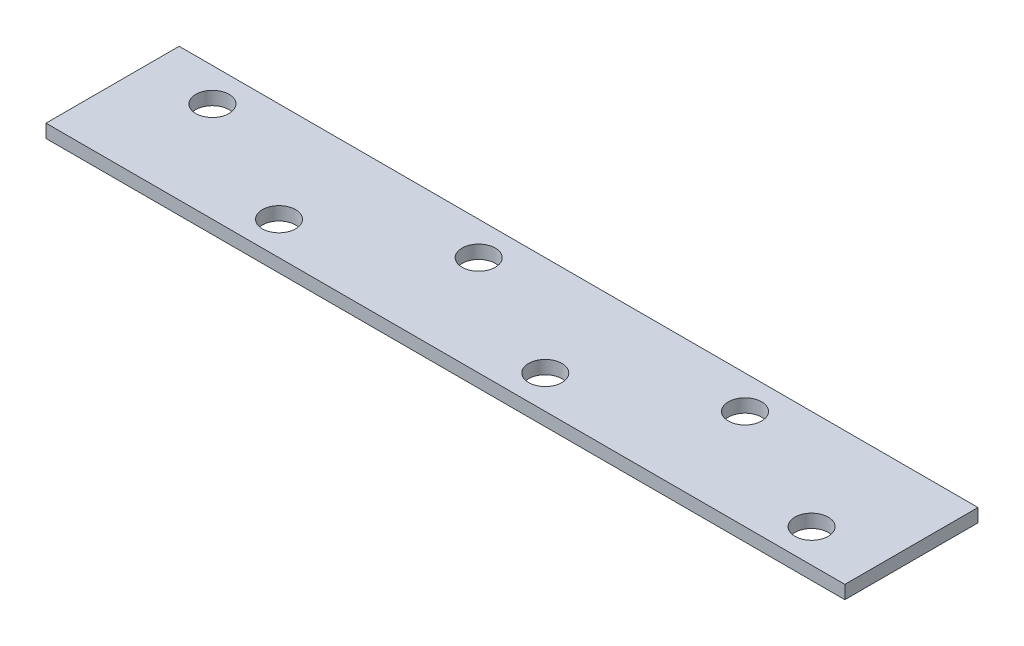
ISO-10303-21;
HEADER;
FILE_DESCRIPTION(('STEP AP214'),'2;1');
FILE_NAME('part.step','',(''),(''),'','','');
FILE_SCHEMA(('AUTOMOTIVE_DESIGN { 1 0 10303 214 1 1 1 1 }'));
ENDSEC;
DATA;
#1=APPLICATION_CONTEXT('core data for automotive mechanical design processes');
#2=APPLICATION_PROTOCOL_DEFINITION('international standard','automotive_design',2000,#1);
#3=PRODUCT_CONTEXT('',#1,'mechanical');
#4=PRODUCT('Part','Part','',(#3));
#5=PRODUCT_RELATED_PRODUCT_CATEGORY('part','',(#4));
#6=PRODUCT_DEFINITION_FORMATION('','',#4);
#7=PRODUCT_DEFINITION_CONTEXT('part definition',#1,'design');
#8=PRODUCT_DEFINITION('design','',#6,#7);
#9=PRODUCT_DEFINITION_SHAPE('','',#8);
#10=(LENGTH_UNIT() NAMED_UNIT(*) SI_UNIT(.MILLI.,.METRE.));
#11=(NAMED_UNIT(*) PLANE_ANGLE_UNIT() SI_UNIT($,.RADIAN.));
#12=(NAMED_UNIT(*) SI_UNIT($,.STERADIAN.) SOLID_ANGLE_UNIT());
#13=UNCERTAINTY_MEASURE_WITH_UNIT(LENGTH_MEASURE(1.E-05),#10,'distance_accuracy_value','');
#14=(GEOMETRIC_REPRESENTATION_CONTEXT(3) GLOBAL_UNCERTAINTY_ASSIGNED_CONTEXT((#13)) GLOBAL_UNIT_ASSIGNED_CONTEXT((#10,
#11,#12)) REPRESENTATION_CONTEXT('',''));
#15=CARTESIAN_POINT('',(0.,0.,0.));
#16=DIRECTION('',(0.,0.,1.));
#17=DIRECTION('',(1.,0.,0.));
#18=AXIS2_PLACEMENT_3D('',#15,#16,#17);
#19=CARTESIAN_POINT('',(0.,2.,0.));
#20=DIRECTION('',(0.,1.,0.));
#21=DIRECTION('',(0.,0.,1.));
#22=AXIS2_PLACEMENT_3D('',#19,#20,#21);
#23=PLANE('',#22);
#24=CARTESIAN_POINT('',(10.0000000000001,2.,5.));
#25=DIRECTION('',(0.,1.,0.));
#26=DIRECTION('',(0.,0.,1.));
#27=AXIS2_PLACEMENT_3D('',#24,#25,#26);
#28=CIRCLE('',#27,2.5);
#29=CARTESIAN_POINT('',(10.0000000000001,2.,7.5));
#30=VERTEX_POINT('',#29);
#31=EDGE_CURVE('E135',#30,#30,#28,.T.);
#32=ORIENTED_EDGE('',*,*,#31,.F.);
#33=EDGE_LOOP('',(#32));
#34=FACE_BOUND('',#33,.T.);
#35=CARTESIAN_POINT('',(30.,2.,-5.));
#36=DIRECTION('',(0.,1.,0.));
#37=DIRECTION('',(0.,0.,1.));
#38=AXIS2_PLACEMENT_3D('',#35,#36,#37);
#39=CIRCLE('',#38,2.5);
#40=CARTESIAN_POINT('',(30.,2.,-2.5));
#41=VERTEX_POINT('',#40);
#42=EDGE_CURVE('E123',#41,#41,#39,.T.);
#43=ORIENTED_EDGE('',*,*,#42,.F.);
#44=EDGE_LOOP('',(#43));
#45=FACE_BOUND('',#44,.T.);
#46=CARTESIAN_POINT('',(-50.,2.,-5.));
#47=DIRECTION('',(0.,1.,0.));
#48=DIRECTION('',(0.,0.,1.));
#49=AXIS2_PLACEMENT_3D('',#46,#47,#48);
#50=CIRCLE('',#49,2.5);
#51=CARTESIAN_POINT('',(-50.,2.,-2.5));
#52=VERTEX_POINT('',#51);
#53=EDGE_CURVE('E102',#52,#52,#50,.T.);
#54=ORIENTED_EDGE('',*,*,#53,.F.);
#55=EDGE_LOOP('',(#54));
#56=FACE_BOUND('',#55,.T.);
#57=DIRECTION('',(0.,0.,-1.));
#58=VECTOR('',#57,1.);
#59=CARTESIAN_POINT('',(60.,2.,-10.));
#60=LINE('',#59,#58);
#61=CARTESIAN_POINT('',(60.,2.,10.));
#62=VERTEX_POINT('',#61);
#63=CARTESIAN_POINT('',(60.,2.,-10.));
#64=VERTEX_POINT('',#63);
#65=EDGE_CURVE('E87',#62,#64,#60,.T.);
#66=ORIENTED_EDGE('',*,*,#65,.T.);
#67=DIRECTION('',(-1.,0.,0.));
#68=VECTOR('',#67,1.);
#69=CARTESIAN_POINT('',(-60.,2.,-10.));
#70=LINE('',#69,#68);
#71=CARTESIAN_POINT('',(-60.,2.,-10.));
#72=VERTEX_POINT('',#71);
#73=EDGE_CURVE('E82',#64,#72,#70,.T.);
#74=ORIENTED_EDGE('',*,*,#73,.T.);
#75=DIRECTION('',(0.,0.,1.));
#76=VECTOR('',#75,1.);
#77=CARTESIAN_POINT('',(-60.,2.,-10.));
#78=LINE('',#77,#76);
#79=CARTESIAN_POINT('',(-60.,2.,10.));
#80=VERTEX_POINT('',#79);
#81=EDGE_CURVE('E85',#72,#80,#78,.T.);
#82=ORIENTED_EDGE('',*,*,#81,.T.);
#83=DIRECTION('',(1.,0.,0.));
#84=VECTOR('',#83,1.);
#85=CARTESIAN_POINT('',(-60.,2.,10.));
#86=LINE('',#85,#84);
#87=EDGE_CURVE('E52',#80,#62,#86,.T.);
#88=ORIENTED_EDGE('',*,*,#87,.T.);
#89=EDGE_LOOP('',(#66,#74,#82,#88));
#90=FACE_BOUND('',#89,.T.);
#91=CARTESIAN_POINT('',(-10.,2.,-5.));
#92=DIRECTION('',(0.,1.,0.));
#93=DIRECTION('',(0.,0.,1.));
#94=AXIS2_PLACEMENT_3D('',#91,#92,#93);
#95=CIRCLE('',#94,2.49999999999999);
#96=CARTESIAN_POINT('',(-10.,2.,-2.5));
#97=VERTEX_POINT('',#96);
#98=EDGE_CURVE('E117',#97,#97,#95,.T.);
#99=ORIENTED_EDGE('',*,*,#98,.F.);
#100=EDGE_LOOP('',(#99));
#101=FACE_BOUND('',#100,.T.);
#102=CARTESIAN_POINT('',(-29.9999999999999,2.,5.));
#103=DIRECTION('',(0.,1.,0.));
#104=DIRECTION('',(0.,0.,1.));
#105=AXIS2_PLACEMENT_3D('',#102,#103,#104);
#106=CIRCLE('',#105,2.5);
#107=CARTESIAN_POINT('',(-29.9999999999999,2.,7.5));
#108=VERTEX_POINT('',#107);
#109=EDGE_CURVE('E129',#108,#108,#106,.T.);
#110=ORIENTED_EDGE('',*,*,#109,.F.);
#111=EDGE_LOOP('',(#110));
#112=FACE_BOUND('',#111,.T.);
#113=CARTESIAN_POINT('',(50.0000000000001,2.,5.));
#114=DIRECTION('',(0.,1.,0.));
#115=DIRECTION('',(0.,0.,1.));
#116=AXIS2_PLACEMENT_3D('',#113,#114,#115);
#117=CIRCLE('',#116,2.5);
#118=CARTESIAN_POINT('',(50.0000000000001,2.,7.5));
#119=VERTEX_POINT('',#118);
#120=EDGE_CURVE('E141',#119,#119,#117,.T.);
#121=ORIENTED_EDGE('',*,*,#120,.F.);
#122=EDGE_LOOP('',(#121));
#123=FACE_BOUND('',#122,.T.);
#124=ADVANCED_FACE('F35',(#34,#45,#56,#90,#101,#112,#123),#23,.T.);
#125=CARTESIAN_POINT('',(0.,0.,0.));
#126=DIRECTION('',(0.,1.,0.));
#127=DIRECTION('',(0.,0.,1.));
#128=AXIS2_PLACEMENT_3D('',#125,#126,#127);
#129=PLANE('',#128);
#130=DIRECTION('',(0.,0.,-1.));
#131=VECTOR('',#130,1.);
#132=CARTESIAN_POINT('',(60.,0.,-10.));
#133=LINE('',#132,#131);
#134=CARTESIAN_POINT('',(60.,0.,10.));
#135=VERTEX_POINT('',#134);
#136=CARTESIAN_POINT('',(60.,0.,-10.));
#137=VERTEX_POINT('',#136);
#138=EDGE_CURVE('E99',#135,#137,#133,.T.);
#139=ORIENTED_EDGE('',*,*,#138,.F.);
#140=DIRECTION('',(1.,0.,0.));
#141=VECTOR('',#140,1.);
#142=CARTESIAN_POINT('',(-60.,0.,10.));
#143=LINE('',#142,#141);
#144=CARTESIAN_POINT('',(-60.,0.,10.));
#145=VERTEX_POINT('',#144);
#146=EDGE_CURVE('E75',#145,#135,#143,.T.);
#147=ORIENTED_EDGE('',*,*,#146,.F.);
#148=DIRECTION('',(0.,0.,1.));
#149=VECTOR('',#148,1.);
#150=CARTESIAN_POINT('',(-60.,0.,-10.));
#151=LINE('',#150,#149);
#152=CARTESIAN_POINT('',(-60.,0.,-10.));
#153=VERTEX_POINT('',#152);
#154=EDGE_CURVE('E69',#153,#145,#151,.T.);
#155=ORIENTED_EDGE('',*,*,#154,.F.);
#156=DIRECTION('',(-1.,0.,0.));
#157=VECTOR('',#156,1.);
#158=CARTESIAN_POINT('',(-60.,0.,-10.));
#159=LINE('',#158,#157);
#160=EDGE_CURVE('E91',#137,#153,#159,.T.);
#161=ORIENTED_EDGE('',*,*,#160,.F.);
#162=EDGE_LOOP('',(#139,#147,#155,#161));
#163=FACE_BOUND('',#162,.T.);
#164=CARTESIAN_POINT('',(-50.,0.,-5.));
#165=DIRECTION('',(0.,1.,0.));
#166=DIRECTION('',(0.,0.,1.));
#167=AXIS2_PLACEMENT_3D('',#164,#165,#166);
#168=CIRCLE('',#167,2.5);
#169=CARTESIAN_POINT('',(-50.,0.,-2.5));
#170=VERTEX_POINT('',#169);
#171=EDGE_CURVE('E114',#170,#170,#168,.T.);
#172=ORIENTED_EDGE('',*,*,#171,.T.);
#173=EDGE_LOOP('',(#172));
#174=FACE_BOUND('',#173,.T.);
#175=CARTESIAN_POINT('',(-10.,0.,-5.));
#176=DIRECTION('',(0.,1.,0.));
#177=DIRECTION('',(0.,0.,1.));
#178=AXIS2_PLACEMENT_3D('',#175,#176,#177);
#179=CIRCLE('',#178,2.49999999999999);
#180=CARTESIAN_POINT('',(-10.,0.,-2.5));
#181=VERTEX_POINT('',#180);
#182=EDGE_CURVE('E120',#181,#181,#179,.T.);
#183=ORIENTED_EDGE('',*,*,#182,.T.);
#184=EDGE_LOOP('',(#183));
#185=FACE_BOUND('',#184,.T.);
#186=CARTESIAN_POINT('',(30.,0.,-5.));
#187=DIRECTION('',(0.,1.,0.));
#188=DIRECTION('',(0.,0.,1.));
#189=AXIS2_PLACEMENT_3D('',#186,#187,#188);
#190=CIRCLE('',#189,2.5);
#191=CARTESIAN_POINT('',(30.,0.,-2.5));
#192=VERTEX_POINT('',#191);
#193=EDGE_CURVE('E126',#192,#192,#190,.T.);
#194=ORIENTED_EDGE('',*,*,#193,.T.);
#195=EDGE_LOOP('',(#194));
#196=FACE_BOUND('',#195,.T.);
#197=CARTESIAN_POINT('',(-29.9999999999999,0.,5.));
#198=DIRECTION('',(0.,1.,0.));
#199=DIRECTION('',(0.,0.,1.));
#200=AXIS2_PLACEMENT_3D('',#197,#198,#199);
#201=CIRCLE('',#200,2.5);
#202=CARTESIAN_POINT('',(-29.9999999999999,0.,7.5));
#203=VERTEX_POINT('',#202);
#204=EDGE_CURVE('E132',#203,#203,#201,.T.);
#205=ORIENTED_EDGE('',*,*,#204,.T.);
#206=EDGE_LOOP('',(#205));
#207=FACE_BOUND('',#206,.T.);
#208=CARTESIAN_POINT('',(10.0000000000001,0.,5.));
#209=DIRECTION('',(0.,1.,0.));
#210=DIRECTION('',(0.,0.,1.));
#211=AXIS2_PLACEMENT_3D('',#208,#209,#210);
#212=CIRCLE('',#211,2.5);
#213=CARTESIAN_POINT('',(10.0000000000001,0.,7.5));
#214=VERTEX_POINT('',#213);
#215=EDGE_CURVE('E138',#214,#214,#212,.T.);
#216=ORIENTED_EDGE('',*,*,#215,.T.);
#217=EDGE_LOOP('',(#216));
#218=FACE_BOUND('',#217,.T.);
#219=CARTESIAN_POINT('',(50.0000000000001,0.,5.));
#220=DIRECTION('',(0.,1.,0.));
#221=DIRECTION('',(0.,0.,1.));
#222=AXIS2_PLACEMENT_3D('',#219,#220,#221);
#223=CIRCLE('',#222,2.5);
#224=CARTESIAN_POINT('',(50.0000000000001,0.,7.5));
#225=VERTEX_POINT('',#224);
#226=EDGE_CURVE('E144',#225,#225,#223,.T.);
#227=ORIENTED_EDGE('',*,*,#226,.T.);
#228=EDGE_LOOP('',(#227));
#229=FACE_BOUND('',#228,.T.);
#230=ADVANCED_FACE('F110',(#163,#174,#185,#196,#207,#218,#229),#129,.F.);
#231=CARTESIAN_POINT('',(60.,2.,-10.));
#232=DIRECTION('',(-1.,0.,0.));
#233=DIRECTION('',(0.,0.,1.));
#234=AXIS2_PLACEMENT_3D('',#231,#232,#233);
#235=PLANE('',#234);
#236=ORIENTED_EDGE('',*,*,#138,.T.);
#237=DIRECTION('',(0.,-1.,0.));
#238=VECTOR('',#237,1.);
#239=CARTESIAN_POINT('',(60.,2.,-10.));
#240=LINE('',#239,#238);
#241=EDGE_CURVE('E11',#64,#137,#240,.T.);
#242=ORIENTED_EDGE('',*,*,#241,.F.);
#243=ORIENTED_EDGE('',*,*,#65,.F.);
#244=DIRECTION('',(0.,-1.,0.));
#245=VECTOR('',#244,1.);
#246=CARTESIAN_POINT('',(60.,2.,10.));
#247=LINE('',#246,#245);
#248=EDGE_CURVE('E95',#62,#135,#247,.T.);
#249=ORIENTED_EDGE('',*,*,#248,.T.);
#250=EDGE_LOOP('',(#236,#242,#243,#249));
#251=FACE_BOUND('',#250,.T.);
#252=ADVANCED_FACE('F37',(#251),#235,.F.);
#253=CARTESIAN_POINT('',(-60.,2.,-10.));
#254=DIRECTION('',(0.,0.,1.));
#255=DIRECTION('',(1.,0.,0.));
#256=AXIS2_PLACEMENT_3D('',#253,#254,#255);
#257=PLANE('',#256);
#258=ORIENTED_EDGE('',*,*,#160,.T.);
#259=DIRECTION('',(0.,-1.,0.));
#260=VECTOR('',#259,1.);
#261=CARTESIAN_POINT('',(-60.,2.,-10.));
#262=LINE('',#261,#260);
#263=EDGE_CURVE('E44',#72,#153,#262,.T.);
#264=ORIENTED_EDGE('',*,*,#263,.F.);
#265=ORIENTED_EDGE('',*,*,#73,.F.);
#266=ORIENTED_EDGE('',*,*,#241,.T.);
#267=EDGE_LOOP('',(#258,#264,#265,#266));
#268=FACE_BOUND('',#267,.T.);
#269=ADVANCED_FACE('F90',(#268),#257,.F.);
#270=CARTESIAN_POINT('',(-60.,2.,-10.));
#271=DIRECTION('',(1.,0.,0.));
#272=DIRECTION('',(0.,0.,-1.));
#273=AXIS2_PLACEMENT_3D('',#270,#271,#272);
#274=PLANE('',#273);
#275=ORIENTED_EDGE('',*,*,#154,.T.);
#276=DIRECTION('',(0.,-1.,0.));
#277=VECTOR('',#276,1.);
#278=CARTESIAN_POINT('',(-60.,2.,10.));
#279=LINE('',#278,#277);
#280=EDGE_CURVE('E92',#80,#145,#279,.T.);
#281=ORIENTED_EDGE('',*,*,#280,.F.);
#282=ORIENTED_EDGE('',*,*,#81,.F.);
#283=ORIENTED_EDGE('',*,*,#263,.T.);
#284=EDGE_LOOP('',(#275,#281,#282,#283));
#285=FACE_BOUND('',#284,.T.);
#286=ADVANCED_FACE('F93',(#285),#274,.F.);
#287=CARTESIAN_POINT('',(-60.,2.,10.));
#288=DIRECTION('',(0.,0.,-1.));
#289=DIRECTION('',(-1.,0.,0.));
#290=AXIS2_PLACEMENT_3D('',#287,#288,#289);
#291=PLANE('',#290);
#292=ORIENTED_EDGE('',*,*,#146,.T.);
#293=ORIENTED_EDGE('',*,*,#248,.F.);
#294=ORIENTED_EDGE('',*,*,#87,.F.);
#295=ORIENTED_EDGE('',*,*,#280,.T.);
#296=EDGE_LOOP('',(#292,#293,#294,#295));
#297=FACE_BOUND('',#296,.T.);
#298=ADVANCED_FACE('F107',(#297),#291,.F.);
#299=CARTESIAN_POINT('',(-50.,2.,-5.));
#300=DIRECTION('',(0.,-1.,0.));
#301=DIRECTION('',(0.,0.,-1.));
#302=AXIS2_PLACEMENT_3D('',#299,#300,#301);
#303=CYLINDRICAL_SURFACE('',#302,2.5);
#304=ORIENTED_EDGE('',*,*,#53,.T.);
#305=EDGE_LOOP('',(#304));
#306=FACE_BOUND('',#305,.T.);
#307=ORIENTED_EDGE('',*,*,#171,.F.);
#308=EDGE_LOOP('',(#307));
#309=FACE_BOUND('',#308,.T.);
#310=ADVANCED_FACE('F163',(#306,#309),#303,.F.);
#311=CARTESIAN_POINT('',(-10.,2.,-5.));
#312=DIRECTION('',(0.,-1.,0.));
#313=DIRECTION('',(0.,0.,-1.));
#314=AXIS2_PLACEMENT_3D('',#311,#312,#313);
#315=CYLINDRICAL_SURFACE('',#314,2.49999999999999);
#316=ORIENTED_EDGE('',*,*,#98,.T.);
#317=EDGE_LOOP('',(#316));
#318=FACE_BOUND('',#317,.T.);
#319=ORIENTED_EDGE('',*,*,#182,.F.);
#320=EDGE_LOOP('',(#319));
#321=FACE_BOUND('',#320,.T.);
#322=ADVANCED_FACE('F209',(#318,#321),#315,.F.);
#323=CARTESIAN_POINT('',(30.,2.,-5.));
#324=DIRECTION('',(0.,-1.,0.));
#325=DIRECTION('',(0.,0.,-1.));
#326=AXIS2_PLACEMENT_3D('',#323,#324,#325);
#327=CYLINDRICAL_SURFACE('',#326,2.5);
#328=ORIENTED_EDGE('',*,*,#42,.T.);
#329=EDGE_LOOP('',(#328));
#330=FACE_BOUND('',#329,.T.);
#331=ORIENTED_EDGE('',*,*,#193,.F.);
#332=EDGE_LOOP('',(#331));
#333=FACE_BOUND('',#332,.T.);
#334=ADVANCED_FACE('F217',(#330,#333),#327,.F.);
#335=CARTESIAN_POINT('',(-29.9999999999999,2.,5.));
#336=DIRECTION('',(0.,-1.,0.));
#337=DIRECTION('',(0.,0.,-1.));
#338=AXIS2_PLACEMENT_3D('',#335,#336,#337);
#339=CYLINDRICAL_SURFACE('',#338,2.5);
#340=ORIENTED_EDGE('',*,*,#109,.T.);
#341=EDGE_LOOP('',(#340));
#342=FACE_BOUND('',#341,.T.);
#343=ORIENTED_EDGE('',*,*,#204,.F.);
#344=EDGE_LOOP('',(#343));
#345=FACE_BOUND('',#344,.T.);
#346=ADVANCED_FACE('F225',(#342,#345),#339,.F.);
#347=CARTESIAN_POINT('',(10.0000000000001,2.,5.));
#348=DIRECTION('',(0.,-1.,0.));
#349=DIRECTION('',(0.,0.,-1.));
#350=AXIS2_PLACEMENT_3D('',#347,#348,#349);
#351=CYLINDRICAL_SURFACE('',#350,2.5);
#352=ORIENTED_EDGE('',*,*,#31,.T.);
#353=EDGE_LOOP('',(#352));
#354=FACE_BOUND('',#353,.T.);
#355=ORIENTED_EDGE('',*,*,#215,.F.);
#356=EDGE_LOOP('',(#355));
#357=FACE_BOUND('',#356,.T.);
#358=ADVANCED_FACE('F234',(#354,#357),#351,.F.);
#359=CARTESIAN_POINT('',(50.0000000000001,2.,5.));
#360=DIRECTION('',(0.,-1.,0.));
#361=DIRECTION('',(0.,0.,-1.));
#362=AXIS2_PLACEMENT_3D('',#359,#360,#361);
#363=CYLINDRICAL_SURFACE('',#362,2.5);
#364=ORIENTED_EDGE('',*,*,#120,.T.);
#365=EDGE_LOOP('',(#364));
#366=FACE_BOUND('',#365,.T.);
#367=ORIENTED_EDGE('',*,*,#226,.F.);
#368=EDGE_LOOP('',(#367));
#369=FACE_BOUND('',#368,.T.);
#370=ADVANCED_FACE('F150',(#366,#369),#363,.F.);
#371=CLOSED_SHELL('',(#124,#230,#252,#269,#286,#298,#310,#322,#334,#346,#358,#370));
#372=MANIFOLD_SOLID_BREP('B2',#371);
#373=ADVANCED_BREP_SHAPE_REPRESENTATION('',(#18,#372),#14);
#374=SHAPE_DEFINITION_REPRESENTATION(#9,#373);
ENDSEC;
END-ISO-10303-21;
